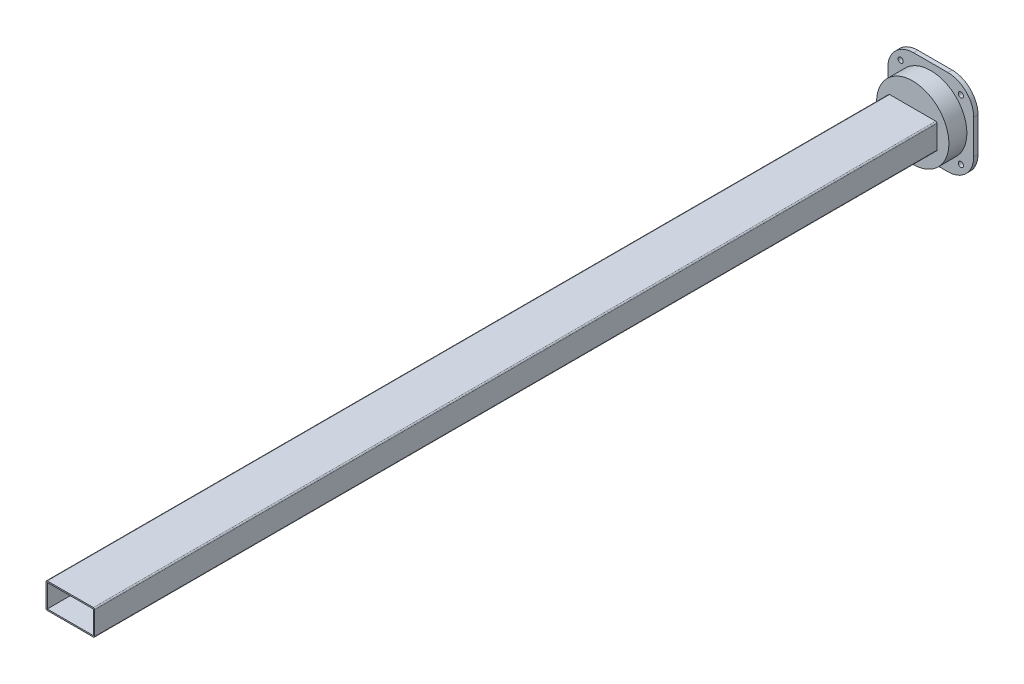
ISO-10303-21;
HEADER;
FILE_DESCRIPTION(('STEP AP214'),'2;1');
FILE_NAME('part.step','',(''),(''),'','','');
FILE_SCHEMA(('AUTOMOTIVE_DESIGN { 1 0 10303 214 1 1 1 1 }'));
ENDSEC;
DATA;
#1=APPLICATION_CONTEXT('core data for automotive mechanical design processes');
#2=APPLICATION_PROTOCOL_DEFINITION('international standard','automotive_design',2000,#1);
#3=PRODUCT_CONTEXT('',#1,'mechanical');
#4=PRODUCT('Part','Part','',(#3));
#5=PRODUCT_RELATED_PRODUCT_CATEGORY('part','',(#4));
#6=PRODUCT_DEFINITION_FORMATION('','',#4);
#7=PRODUCT_DEFINITION_CONTEXT('part definition',#1,'design');
#8=PRODUCT_DEFINITION('design','',#6,#7);
#9=PRODUCT_DEFINITION_SHAPE('','',#8);
#10=(LENGTH_UNIT() NAMED_UNIT(*) SI_UNIT(.MILLI.,.METRE.));
#11=(NAMED_UNIT(*) PLANE_ANGLE_UNIT() SI_UNIT($,.RADIAN.));
#12=(NAMED_UNIT(*) SI_UNIT($,.STERADIAN.) SOLID_ANGLE_UNIT());
#13=UNCERTAINTY_MEASURE_WITH_UNIT(LENGTH_MEASURE(1.E-05),#10,'distance_accuracy_value','');
#14=(GEOMETRIC_REPRESENTATION_CONTEXT(3) GLOBAL_UNCERTAINTY_ASSIGNED_CONTEXT((#13)) GLOBAL_UNIT_ASSIGNED_CONTEXT((#10,
#11,#12)) REPRESENTATION_CONTEXT('',''));
#15=CARTESIAN_POINT('',(0.,0.,0.));
#16=DIRECTION('',(0.,0.,1.));
#17=DIRECTION('',(1.,0.,0.));
#18=AXIS2_PLACEMENT_3D('',#15,#16,#17);
#19=CARTESIAN_POINT('',(19.9299665264319,19.9553177882326,-5.));
#20=DIRECTION('',(0.,0.,1.));
#21=DIRECTION('',(1.,0.,0.));
#22=AXIS2_PLACEMENT_3D('',#19,#20,#21);
#23=PLANE('',#22);
#24=CARTESIAN_POINT('',(0.,0.,-5.));
#25=DIRECTION('',(0.,0.,-1.));
#26=DIRECTION('',(-1.,0.,0.));
#27=AXIS2_PLACEMENT_3D('',#24,#25,#26);
#28=CIRCLE('',#27,35.);
#29=CARTESIAN_POINT('',(-35.,0.,-5.));
#30=VERTEX_POINT('',#29);
#31=EDGE_CURVE('E436',#30,#30,#28,.T.);
#32=ORIENTED_EDGE('',*,*,#31,.T.);
#33=EDGE_LOOP('',(#32));
#34=FACE_BOUND('',#33,.T.);
#35=DIRECTION('',(0.,-1.,0.));
#36=VECTOR('',#35,1.);
#37=CARTESIAN_POINT('',(26.767,19.9553177882326,-5.));
#38=LINE('',#37,#36);
#39=CARTESIAN_POINT('',(26.767,13.3835,-4.99999999999989));
#40=VERTEX_POINT('',#39);
#41=CARTESIAN_POINT('',(26.767,-13.3835,-5.));
#42=VERTEX_POINT('',#41);
#43=EDGE_CURVE('E11',#40,#42,#38,.T.);
#44=ORIENTED_EDGE('',*,*,#43,.F.);
#45=DIRECTION('',(1.,0.,0.));
#46=VECTOR('',#45,1.);
#47=CARTESIAN_POINT('',(19.9299665264319,13.3835,-5.));
#48=LINE('',#47,#46);
#49=CARTESIAN_POINT('',(-26.767,13.3835,-4.99999999999989));
#50=VERTEX_POINT('',#49);
#51=EDGE_CURVE('E48',#50,#40,#48,.T.);
#52=ORIENTED_EDGE('',*,*,#51,.F.);
#53=DIRECTION('',(0.,1.,0.));
#54=VECTOR('',#53,1.);
#55=CARTESIAN_POINT('',(-26.767,19.9553177882326,-5.));
#56=LINE('',#55,#54);
#57=CARTESIAN_POINT('',(-26.767,-13.3835,-4.99999999999989));
#58=VERTEX_POINT('',#57);
#59=EDGE_CURVE('E183',#58,#50,#56,.T.);
#60=ORIENTED_EDGE('',*,*,#59,.F.);
#61=DIRECTION('',(-1.,0.,0.));
#62=VECTOR('',#61,1.);
#63=CARTESIAN_POINT('',(19.9299665264319,-13.3835,-5.));
#64=LINE('',#63,#62);
#65=EDGE_CURVE('E192',#42,#58,#64,.T.);
#66=ORIENTED_EDGE('',*,*,#65,.F.);
#67=EDGE_LOOP('',(#44,#52,#60,#66));
#68=FACE_BOUND('',#67,.T.);
#69=ADVANCED_FACE('F39',(#34,#68),#23,.F.);
#70=CARTESIAN_POINT('',(-26.767,13.3835,1000.));
#71=DIRECTION('',(0.,0.,-1.));
#72=DIRECTION('',(-1.,0.,0.));
#73=AXIS2_PLACEMENT_3D('',#70,#71,#72);
#74=CYLINDRICAL_SURFACE('',#73,1.5);
#75=CARTESIAN_POINT('',(-26.767,13.3835,20.94125));
#76=DIRECTION('',(0.,0.,-1.));
#77=DIRECTION('',(-1.,0.,0.));
#78=AXIS2_PLACEMENT_3D('',#75,#76,#77);
#79=CIRCLE('',#78,1.5);
#80=CARTESIAN_POINT('',(-28.267,13.3835,20.94125));
#81=VERTEX_POINT('',#80);
#82=CARTESIAN_POINT('',(-26.767,14.8835,20.94125));
#83=VERTEX_POINT('',#82);
#84=EDGE_CURVE('E62',#81,#83,#79,.T.);
#85=ORIENTED_EDGE('',*,*,#84,.F.);
#86=DIRECTION('',(0.,0.,-1.));
#87=VECTOR('',#86,1.);
#88=CARTESIAN_POINT('',(-28.267,13.3835,1000.));
#89=LINE('',#88,#87);
#90=CARTESIAN_POINT('',(-28.267,13.3835,1000.));
#91=VERTEX_POINT('',#90);
#92=EDGE_CURVE('E254',#91,#81,#89,.T.);
#93=ORIENTED_EDGE('',*,*,#92,.F.);
#94=CARTESIAN_POINT('',(-26.767,13.3835,1000.));
#95=DIRECTION('',(0.,0.,1.));
#96=DIRECTION('',(1.,0.,0.));
#97=AXIS2_PLACEMENT_3D('',#94,#95,#96);
#98=CIRCLE('',#97,1.5);
#99=CARTESIAN_POINT('',(-26.767,14.8835,1000.));
#100=VERTEX_POINT('',#99);
#101=EDGE_CURVE('E226',#100,#91,#98,.T.);
#102=ORIENTED_EDGE('',*,*,#101,.F.);
#103=DIRECTION('',(0.,0.,-1.));
#104=VECTOR('',#103,1.);
#105=CARTESIAN_POINT('',(-26.767,14.8835,1000.));
#106=LINE('',#105,#104);
#107=EDGE_CURVE('E251',#100,#83,#106,.T.);
#108=ORIENTED_EDGE('',*,*,#107,.T.);
#109=EDGE_LOOP('',(#85,#93,#102,#108));
#110=FACE_BOUND('',#109,.T.);
#111=ADVANCED_FACE('F524',(#110),#74,.T.);
#112=CARTESIAN_POINT('',(-28.267,13.3835,1000.));
#113=DIRECTION('',(1.,0.,0.));
#114=DIRECTION('',(0.,1.,0.));
#115=AXIS2_PLACEMENT_3D('',#112,#113,#114);
#116=PLANE('',#115);
#117=DIRECTION('',(0.,1.,0.));
#118=VECTOR('',#117,1.);
#119=CARTESIAN_POINT('',(-28.267,13.3835,20.94125));
#120=LINE('',#119,#118);
#121=CARTESIAN_POINT('',(-28.267,-13.3835,20.94125));
#122=VERTEX_POINT('',#121);
#123=EDGE_CURVE('E281',#122,#81,#120,.T.);
#124=ORIENTED_EDGE('',*,*,#123,.F.);
#125=DIRECTION('',(0.,0.,-1.));
#126=VECTOR('',#125,1.);
#127=CARTESIAN_POINT('',(-28.267,-13.3835,1000.));
#128=LINE('',#127,#126);
#129=CARTESIAN_POINT('',(-28.267,-13.3835,1000.));
#130=VERTEX_POINT('',#129);
#131=EDGE_CURVE('E273',#130,#122,#128,.T.);
#132=ORIENTED_EDGE('',*,*,#131,.F.);
#133=DIRECTION('',(0.,-1.,0.));
#134=VECTOR('',#133,1.);
#135=CARTESIAN_POINT('',(-28.267,13.3835,1000.));
#136=LINE('',#135,#134);
#137=EDGE_CURVE('E230',#91,#130,#136,.T.);
#138=ORIENTED_EDGE('',*,*,#137,.F.);
#139=ORIENTED_EDGE('',*,*,#92,.T.);
#140=EDGE_LOOP('',(#124,#132,#138,#139));
#141=FACE_BOUND('',#140,.T.);
#142=ADVANCED_FACE('F531',(#141),#116,.F.);
#143=CARTESIAN_POINT('',(-26.767,-13.3835,1000.));
#144=DIRECTION('',(0.,0.,-1.));
#145=DIRECTION('',(-1.,0.,0.));
#146=AXIS2_PLACEMENT_3D('',#143,#144,#145);
#147=CYLINDRICAL_SURFACE('',#146,1.5);
#148=CARTESIAN_POINT('',(-26.767,-13.3835,20.94125));
#149=DIRECTION('',(0.,0.,-1.));
#150=DIRECTION('',(-1.,0.,0.));
#151=AXIS2_PLACEMENT_3D('',#148,#149,#150);
#152=CIRCLE('',#151,1.5);
#153=CARTESIAN_POINT('',(-26.767,-14.8835,20.94125));
#154=VERTEX_POINT('',#153);
#155=EDGE_CURVE('E285',#154,#122,#152,.T.);
#156=ORIENTED_EDGE('',*,*,#155,.F.);
#157=DIRECTION('',(0.,0.,-1.));
#158=VECTOR('',#157,1.);
#159=CARTESIAN_POINT('',(-26.767,-14.8835,1000.));
#160=LINE('',#159,#158);
#161=CARTESIAN_POINT('',(-26.767,-14.8835,1000.));
#162=VERTEX_POINT('',#161);
#163=EDGE_CURVE('E269',#162,#154,#160,.T.);
#164=ORIENTED_EDGE('',*,*,#163,.F.);
#165=CARTESIAN_POINT('',(-26.767,-13.3835,1000.));
#166=DIRECTION('',(0.,0.,1.));
#167=DIRECTION('',(-1.,0.,0.));
#168=AXIS2_PLACEMENT_3D('',#165,#166,#167);
#169=CIRCLE('',#168,1.5);
#170=EDGE_CURVE('E233',#130,#162,#169,.T.);
#171=ORIENTED_EDGE('',*,*,#170,.F.);
#172=ORIENTED_EDGE('',*,*,#131,.T.);
#173=EDGE_LOOP('',(#156,#164,#171,#172));
#174=FACE_BOUND('',#173,.T.);
#175=ADVANCED_FACE('F793',(#174),#147,.T.);
#176=CARTESIAN_POINT('',(-26.767,-14.8835,1000.));
#177=DIRECTION('',(0.,1.,0.));
#178=DIRECTION('',(0.,0.,1.));
#179=AXIS2_PLACEMENT_3D('',#176,#177,#178);
#180=PLANE('',#179);
#181=DIRECTION('',(-1.,0.,0.));
#182=VECTOR('',#181,1.);
#183=CARTESIAN_POINT('',(-26.767,-14.8835,20.94125));
#184=LINE('',#183,#182);
#185=CARTESIAN_POINT('',(26.767,-14.8835,20.94125));
#186=VERTEX_POINT('',#185);
#187=EDGE_CURVE('E289',#186,#154,#184,.T.);
#188=ORIENTED_EDGE('',*,*,#187,.F.);
#189=DIRECTION('',(0.,0.,-1.));
#190=VECTOR('',#189,1.);
#191=CARTESIAN_POINT('',(26.767,-14.8835,1000.));
#192=LINE('',#191,#190);
#193=CARTESIAN_POINT('',(26.767,-14.8835,1000.));
#194=VERTEX_POINT('',#193);
#195=EDGE_CURVE('E265',#194,#186,#192,.T.);
#196=ORIENTED_EDGE('',*,*,#195,.F.);
#197=DIRECTION('',(1.,0.,0.));
#198=VECTOR('',#197,1.);
#199=CARTESIAN_POINT('',(-26.767,-14.8835,1000.));
#200=LINE('',#199,#198);
#201=EDGE_CURVE('E236',#162,#194,#200,.T.);
#202=ORIENTED_EDGE('',*,*,#201,.F.);
#203=ORIENTED_EDGE('',*,*,#163,.T.);
#204=EDGE_LOOP('',(#188,#196,#202,#203));
#205=FACE_BOUND('',#204,.T.);
#206=ADVANCED_FACE('F783',(#205),#180,.F.);
#207=CARTESIAN_POINT('',(26.767,-13.3835,1000.));
#208=DIRECTION('',(0.,0.,-1.));
#209=DIRECTION('',(-1.,0.,0.));
#210=AXIS2_PLACEMENT_3D('',#207,#208,#209);
#211=CYLINDRICAL_SURFACE('',#210,1.50000000000001);
#212=CARTESIAN_POINT('',(26.767,-13.3835,20.94125));
#213=DIRECTION('',(0.,0.,-1.));
#214=DIRECTION('',(-1.,0.,0.));
#215=AXIS2_PLACEMENT_3D('',#212,#213,#214);
#216=CIRCLE('',#215,1.50000000000001);
#217=CARTESIAN_POINT('',(28.267,-13.3835,20.94125));
#218=VERTEX_POINT('',#217);
#219=EDGE_CURVE('E293',#218,#186,#216,.T.);
#220=ORIENTED_EDGE('',*,*,#219,.F.);
#221=DIRECTION('',(0.,0.,-1.));
#222=VECTOR('',#221,1.);
#223=CARTESIAN_POINT('',(28.267,-13.3835,1000.));
#224=LINE('',#223,#222);
#225=CARTESIAN_POINT('',(28.267,-13.3835,1000.));
#226=VERTEX_POINT('',#225);
#227=EDGE_CURVE('E261',#226,#218,#224,.T.);
#228=ORIENTED_EDGE('',*,*,#227,.F.);
#229=CARTESIAN_POINT('',(26.767,-13.3835,1000.));
#230=DIRECTION('',(0.,0.,1.));
#231=DIRECTION('',(-1.,0.,0.));
#232=AXIS2_PLACEMENT_3D('',#229,#230,#231);
#233=CIRCLE('',#232,1.50000000000001);
#234=EDGE_CURVE('E239',#194,#226,#233,.T.);
#235=ORIENTED_EDGE('',*,*,#234,.F.);
#236=ORIENTED_EDGE('',*,*,#195,.T.);
#237=EDGE_LOOP('',(#220,#228,#235,#236));
#238=FACE_BOUND('',#237,.T.);
#239=ADVANCED_FACE('F773',(#238),#211,.T.);
#240=CARTESIAN_POINT('',(28.267,13.3835,1000.));
#241=DIRECTION('',(-1.,0.,0.));
#242=DIRECTION('',(0.,-1.,0.));
#243=AXIS2_PLACEMENT_3D('',#240,#241,#242);
#244=PLANE('',#243);
#245=DIRECTION('',(0.,-1.,0.));
#246=VECTOR('',#245,1.);
#247=CARTESIAN_POINT('',(28.267,13.3835,20.94125));
#248=LINE('',#247,#246);
#249=CARTESIAN_POINT('',(28.267,13.3835,20.94125));
#250=VERTEX_POINT('',#249);
#251=EDGE_CURVE('E297',#250,#218,#248,.T.);
#252=ORIENTED_EDGE('',*,*,#251,.F.);
#253=DIRECTION('',(0.,0.,-1.));
#254=VECTOR('',#253,1.);
#255=CARTESIAN_POINT('',(28.267,13.3835,1000.));
#256=LINE('',#255,#254);
#257=CARTESIAN_POINT('',(28.267,13.3835,1000.));
#258=VERTEX_POINT('',#257);
#259=EDGE_CURVE('E257',#258,#250,#256,.T.);
#260=ORIENTED_EDGE('',*,*,#259,.F.);
#261=DIRECTION('',(0.,1.,0.));
#262=VECTOR('',#261,1.);
#263=CARTESIAN_POINT('',(28.267,13.3835,1000.));
#264=LINE('',#263,#262);
#265=EDGE_CURVE('E242',#226,#258,#264,.T.);
#266=ORIENTED_EDGE('',*,*,#265,.F.);
#267=ORIENTED_EDGE('',*,*,#227,.T.);
#268=EDGE_LOOP('',(#252,#260,#266,#267));
#269=FACE_BOUND('',#268,.T.);
#270=ADVANCED_FACE('F763',(#269),#244,.F.);
#271=CARTESIAN_POINT('',(26.767,13.3835,1000.));
#272=DIRECTION('',(0.,0.,-1.));
#273=DIRECTION('',(-1.,0.,0.));
#274=AXIS2_PLACEMENT_3D('',#271,#272,#273);
#275=CYLINDRICAL_SURFACE('',#274,1.50000000000001);
#276=CARTESIAN_POINT('',(26.767,13.3835,20.94125));
#277=DIRECTION('',(0.,0.,-1.));
#278=DIRECTION('',(-1.,0.,0.));
#279=AXIS2_PLACEMENT_3D('',#276,#277,#278);
#280=CIRCLE('',#279,1.50000000000001);
#281=CARTESIAN_POINT('',(26.767,14.8835,20.94125));
#282=VERTEX_POINT('',#281);
#283=EDGE_CURVE('E301',#282,#250,#280,.T.);
#284=ORIENTED_EDGE('',*,*,#283,.F.);
#285=DIRECTION('',(0.,0.,-1.));
#286=VECTOR('',#285,1.);
#287=CARTESIAN_POINT('',(26.767,14.8835,1000.));
#288=LINE('',#287,#286);
#289=CARTESIAN_POINT('',(26.767,14.8835,1000.));
#290=VERTEX_POINT('',#289);
#291=EDGE_CURVE('E225',#290,#282,#288,.T.);
#292=ORIENTED_EDGE('',*,*,#291,.F.);
#293=CARTESIAN_POINT('',(26.767,13.3835,1000.));
#294=DIRECTION('',(0.,0.,1.));
#295=DIRECTION('',(-1.,0.,0.));
#296=AXIS2_PLACEMENT_3D('',#293,#294,#295);
#297=CIRCLE('',#296,1.50000000000001);
#298=EDGE_CURVE('E245',#258,#290,#297,.T.);
#299=ORIENTED_EDGE('',*,*,#298,.F.);
#300=ORIENTED_EDGE('',*,*,#259,.T.);
#301=EDGE_LOOP('',(#284,#292,#299,#300));
#302=FACE_BOUND('',#301,.T.);
#303=ADVANCED_FACE('F753',(#302),#275,.T.);
#304=CARTESIAN_POINT('',(-26.767,14.8835,1000.));
#305=DIRECTION('',(0.,-1.,0.));
#306=DIRECTION('',(0.,0.,-1.));
#307=AXIS2_PLACEMENT_3D('',#304,#305,#306);
#308=PLANE('',#307);
#309=DIRECTION('',(1.,0.,0.));
#310=VECTOR('',#309,1.);
#311=CARTESIAN_POINT('',(-26.767,14.8835,20.94125));
#312=LINE('',#311,#310);
#313=EDGE_CURVE('E305',#83,#282,#312,.T.);
#314=ORIENTED_EDGE('',*,*,#313,.F.);
#315=ORIENTED_EDGE('',*,*,#107,.F.);
#316=DIRECTION('',(-1.,0.,0.));
#317=VECTOR('',#316,1.);
#318=CARTESIAN_POINT('',(-26.767,14.8835,1000.));
#319=LINE('',#318,#317);
#320=EDGE_CURVE('E248',#290,#100,#319,.T.);
#321=ORIENTED_EDGE('',*,*,#320,.F.);
#322=ORIENTED_EDGE('',*,*,#291,.T.);
#323=EDGE_LOOP('',(#314,#315,#321,#322));
#324=FACE_BOUND('',#323,.T.);
#325=ADVANCED_FACE('F601',(#324),#308,.F.);
#326=CARTESIAN_POINT('',(26.767,13.3835,1000.));
#327=DIRECTION('',(-1.,0.,0.));
#328=DIRECTION('',(0.,0.,1.));
#329=AXIS2_PLACEMENT_3D('',#326,#327,#328);
#330=PLANE('',#329);
#331=DIRECTION('',(0.,0.,-1.));
#332=VECTOR('',#331,1.);
#333=CARTESIAN_POINT('',(26.767,13.3835,1000.));
#334=LINE('',#333,#332);
#335=CARTESIAN_POINT('',(26.767,13.3835,1000.));
#336=VERTEX_POINT('',#335);
#337=EDGE_CURVE('E212',#336,#40,#334,.T.);
#338=ORIENTED_EDGE('',*,*,#337,.T.);
#339=ORIENTED_EDGE('',*,*,#43,.T.);
#340=DIRECTION('',(0.,0.,-1.));
#341=VECTOR('',#340,1.);
#342=CARTESIAN_POINT('',(26.767,-13.3835,1000.));
#343=LINE('',#342,#341);
#344=CARTESIAN_POINT('',(26.767,-13.3835,1000.));
#345=VERTEX_POINT('',#344);
#346=EDGE_CURVE('E55',#345,#42,#343,.T.);
#347=ORIENTED_EDGE('',*,*,#346,.F.);
#348=DIRECTION('',(0.,1.,0.));
#349=VECTOR('',#348,1.);
#350=CARTESIAN_POINT('',(26.767,13.3835,1000.));
#351=LINE('',#350,#349);
#352=EDGE_CURVE('E208',#345,#336,#351,.T.);
#353=ORIENTED_EDGE('',*,*,#352,.T.);
#354=EDGE_LOOP('',(#338,#339,#347,#353));
#355=FACE_BOUND('',#354,.T.);
#356=ADVANCED_FACE('F597',(#355),#330,.T.);
#357=CARTESIAN_POINT('',(-26.767,13.3835,1000.));
#358=DIRECTION('',(0.,-1.,0.));
#359=DIRECTION('',(0.,0.,-1.));
#360=AXIS2_PLACEMENT_3D('',#357,#358,#359);
#361=PLANE('',#360);
#362=DIRECTION('',(0.,0.,-1.));
#363=VECTOR('',#362,1.);
#364=CARTESIAN_POINT('',(-26.767,13.3835,1000.));
#365=LINE('',#364,#363);
#366=CARTESIAN_POINT('',(-26.767,13.3835,1000.));
#367=VERTEX_POINT('',#366);
#368=EDGE_CURVE('E211',#367,#50,#365,.T.);
#369=ORIENTED_EDGE('',*,*,#368,.T.);
#370=ORIENTED_EDGE('',*,*,#51,.T.);
#371=ORIENTED_EDGE('',*,*,#337,.F.);
#372=DIRECTION('',(-1.,0.,0.));
#373=VECTOR('',#372,1.);
#374=CARTESIAN_POINT('',(-26.767,13.3835,1000.));
#375=LINE('',#374,#373);
#376=EDGE_CURVE('E189',#336,#367,#375,.T.);
#377=ORIENTED_EDGE('',*,*,#376,.T.);
#378=EDGE_LOOP('',(#369,#370,#371,#377));
#379=FACE_BOUND('',#378,.T.);
#380=ADVANCED_FACE('F600',(#379),#361,.T.);
#381=CARTESIAN_POINT('',(-26.767,13.3835,1000.));
#382=DIRECTION('',(1.,0.,0.));
#383=DIRECTION('',(0.,0.,-1.));
#384=AXIS2_PLACEMENT_3D('',#381,#382,#383);
#385=PLANE('',#384);
#386=DIRECTION('',(0.,0.,-1.));
#387=VECTOR('',#386,1.);
#388=CARTESIAN_POINT('',(-26.767,-13.3835,1000.));
#389=LINE('',#388,#387);
#390=CARTESIAN_POINT('',(-26.767,-13.3835,1000.));
#391=VERTEX_POINT('',#390);
#392=EDGE_CURVE('E179',#391,#58,#389,.T.);
#393=ORIENTED_EDGE('',*,*,#392,.T.);
#394=ORIENTED_EDGE('',*,*,#59,.T.);
#395=ORIENTED_EDGE('',*,*,#368,.F.);
#396=DIRECTION('',(0.,-1.,0.));
#397=VECTOR('',#396,1.);
#398=CARTESIAN_POINT('',(-26.767,13.3835,1000.));
#399=LINE('',#398,#397);
#400=EDGE_CURVE('E186',#367,#391,#399,.T.);
#401=ORIENTED_EDGE('',*,*,#400,.T.);
#402=EDGE_LOOP('',(#393,#394,#395,#401));
#403=FACE_BOUND('',#402,.T.);
#404=ADVANCED_FACE('F180',(#403),#385,.T.);
#405=CARTESIAN_POINT('',(-26.767,-13.3835,1000.));
#406=DIRECTION('',(0.,1.,0.));
#407=DIRECTION('',(0.,0.,1.));
#408=AXIS2_PLACEMENT_3D('',#405,#406,#407);
#409=PLANE('',#408);
#410=ORIENTED_EDGE('',*,*,#346,.T.);
#411=ORIENTED_EDGE('',*,*,#65,.T.);
#412=ORIENTED_EDGE('',*,*,#392,.F.);
#413=DIRECTION('',(1.,0.,0.));
#414=VECTOR('',#413,1.);
#415=CARTESIAN_POINT('',(-26.767,-13.3835,1000.));
#416=LINE('',#415,#414);
#417=EDGE_CURVE('E207',#391,#345,#416,.T.);
#418=ORIENTED_EDGE('',*,*,#417,.T.);
#419=EDGE_LOOP('',(#410,#411,#412,#418));
#420=FACE_BOUND('',#419,.T.);
#421=ADVANCED_FACE('F193',(#420),#409,.T.);
#422=CARTESIAN_POINT('',(-26.767,13.3835,1000.));
#423=DIRECTION('',(0.,0.,1.));
#424=DIRECTION('',(1.,0.,0.));
#425=AXIS2_PLACEMENT_3D('',#422,#423,#424);
#426=PLANE('',#425);
#427=ORIENTED_EDGE('',*,*,#101,.T.);
#428=ORIENTED_EDGE('',*,*,#137,.T.);
#429=ORIENTED_EDGE('',*,*,#170,.T.);
#430=ORIENTED_EDGE('',*,*,#201,.T.);
#431=ORIENTED_EDGE('',*,*,#234,.T.);
#432=ORIENTED_EDGE('',*,*,#265,.T.);
#433=ORIENTED_EDGE('',*,*,#298,.T.);
#434=ORIENTED_EDGE('',*,*,#320,.T.);
#435=EDGE_LOOP('',(#427,#428,#429,#430,#431,#432,#433,#434));
#436=FACE_BOUND('',#435,.T.);
#437=ORIENTED_EDGE('',*,*,#376,.F.);
#438=ORIENTED_EDGE('',*,*,#352,.F.);
#439=ORIENTED_EDGE('',*,*,#417,.F.);
#440=ORIENTED_EDGE('',*,*,#400,.F.);
#441=EDGE_LOOP('',(#437,#438,#439,#440));
#442=FACE_BOUND('',#441,.T.);
#443=ADVANCED_FACE('F630',(#436,#442),#426,.T.);
#444=CARTESIAN_POINT('',(0.,0.,20.94125));
#445=DIRECTION('',(0.,0.,-1.));
#446=DIRECTION('',(-1.,0.,0.));
#447=AXIS2_PLACEMENT_3D('',#444,#445,#446);
#448=CYLINDRICAL_SURFACE('',#447,42.);
#449=CARTESIAN_POINT('',(0.,0.,0.));
#450=DIRECTION('',(0.,0.,1.));
#451=DIRECTION('',(1.,0.,0.));
#452=AXIS2_PLACEMENT_3D('',#449,#450,#451);
#453=CIRCLE('',#452,42.);
#454=CARTESIAN_POINT('',(42.,0.,0.));
#455=VERTEX_POINT('',#454);
#456=EDGE_CURVE('E197',#455,#455,#453,.F.);
#457=ORIENTED_EDGE('',*,*,#456,.F.);
#458=EDGE_LOOP('',(#457));
#459=FACE_BOUND('',#458,.T.);
#460=CARTESIAN_POINT('',(0.,0.,20.94125));
#461=DIRECTION('',(0.,0.,-1.));
#462=DIRECTION('',(-1.,0.,0.));
#463=AXIS2_PLACEMENT_3D('',#460,#461,#462);
#464=CIRCLE('',#463,42.);
#465=CARTESIAN_POINT('',(-42.,0.,20.94125));
#466=VERTEX_POINT('',#465);
#467=EDGE_CURVE('E309',#466,#466,#464,.T.);
#468=ORIENTED_EDGE('',*,*,#467,.T.);
#469=EDGE_LOOP('',(#468));
#470=FACE_BOUND('',#469,.T.);
#471=ADVANCED_FACE('F636',(#459,#470),#448,.T.);
#472=CARTESIAN_POINT('',(0.,0.,20.94125));
#473=DIRECTION('',(0.,0.,-1.));
#474=DIRECTION('',(-1.,0.,0.));
#475=AXIS2_PLACEMENT_3D('',#472,#473,#474);
#476=PLANE('',#475);
#477=ORIENTED_EDGE('',*,*,#467,.F.);
#478=EDGE_LOOP('',(#477));
#479=FACE_BOUND('',#478,.T.);
#480=ORIENTED_EDGE('',*,*,#123,.T.);
#481=ORIENTED_EDGE('',*,*,#84,.T.);
#482=ORIENTED_EDGE('',*,*,#313,.T.);
#483=ORIENTED_EDGE('',*,*,#283,.T.);
#484=ORIENTED_EDGE('',*,*,#251,.T.);
#485=ORIENTED_EDGE('',*,*,#219,.T.);
#486=ORIENTED_EDGE('',*,*,#187,.T.);
#487=ORIENTED_EDGE('',*,*,#155,.T.);
#488=EDGE_LOOP('',(#480,#481,#482,#483,#484,#485,#486,#487));
#489=FACE_BOUND('',#488,.T.);
#490=ADVANCED_FACE('F640',(#479,#489),#476,.F.);
#491=CARTESIAN_POINT('',(19.9299665264317,49.9553177882326,-5.));
#492=DIRECTION('',(0.,-1.,0.));
#493=DIRECTION('',(0.,0.,-1.));
#494=AXIS2_PLACEMENT_3D('',#491,#492,#493);
#495=PLANE('',#494);
#496=DIRECTION('',(1.,0.,0.));
#497=VECTOR('',#496,1.);
#498=CARTESIAN_POINT('',(19.9299665264317,49.9553177882326,0.));
#499=LINE('',#498,#497);
#500=CARTESIAN_POINT('',(-19.9299665264317,49.9553177882326,0.));
#501=VERTEX_POINT('',#500);
#502=CARTESIAN_POINT('',(19.9299665264317,49.9553177882326,0.));
#503=VERTEX_POINT('',#502);
#504=EDGE_CURVE('E346',#501,#503,#499,.T.);
#505=ORIENTED_EDGE('',*,*,#504,.T.);
#506=DIRECTION('',(0.,0.,1.));
#507=VECTOR('',#506,1.);
#508=CARTESIAN_POINT('',(19.9299665264317,49.9553177882326,-5.));
#509=LINE('',#508,#507);
#510=CARTESIAN_POINT('',(19.9299665264317,49.9553177882326,-5.));
#511=VERTEX_POINT('',#510);
#512=EDGE_CURVE('E341',#511,#503,#509,.T.);
#513=ORIENTED_EDGE('',*,*,#512,.F.);
#514=DIRECTION('',(1.,0.,0.));
#515=VECTOR('',#514,1.);
#516=CARTESIAN_POINT('',(19.9299665264317,49.9553177882326,-5.));
#517=LINE('',#516,#515);
#518=CARTESIAN_POINT('',(-19.9299665264317,49.9553177882326,-5.));
#519=VERTEX_POINT('',#518);
#520=EDGE_CURVE('E345',#519,#511,#517,.T.);
#521=ORIENTED_EDGE('',*,*,#520,.F.);
#522=DIRECTION('',(0.,0.,1.));
#523=VECTOR('',#522,1.);
#524=CARTESIAN_POINT('',(-19.9299665264317,49.9553177882326,-5.));
#525=LINE('',#524,#523);
#526=EDGE_CURVE('E337',#519,#501,#525,.T.);
#527=ORIENTED_EDGE('',*,*,#526,.T.);
#528=EDGE_LOOP('',(#505,#513,#521,#527));
#529=FACE_BOUND('',#528,.T.);
#530=ADVANCED_FACE('F507',(#529),#495,.F.);
#531=CARTESIAN_POINT('',(-19.9299665264319,19.9553177882326,-5.));
#532=DIRECTION('',(0.,0.,1.));
#533=DIRECTION('',(1.,0.,0.));
#534=AXIS2_PLACEMENT_3D('',#531,#532,#533);
#535=CYLINDRICAL_SURFACE('',#534,30.);
#536=CARTESIAN_POINT('',(-19.9299665264319,19.9553177882326,0.));
#537=DIRECTION('',(0.,0.,-1.));
#538=DIRECTION('',(-1.,0.,0.));
#539=AXIS2_PLACEMENT_3D('',#536,#537,#538);
#540=CIRCLE('',#539,30.);
#541=CARTESIAN_POINT('',(-49.9299665264319,19.9553177882324,0.));
#542=VERTEX_POINT('',#541);
#543=EDGE_CURVE('E350',#542,#501,#540,.T.);
#544=ORIENTED_EDGE('',*,*,#543,.T.);
#545=ORIENTED_EDGE('',*,*,#526,.F.);
#546=CARTESIAN_POINT('',(-19.9299665264319,19.9553177882326,-5.));
#547=DIRECTION('',(0.,0.,-1.));
#548=DIRECTION('',(-1.,0.,0.));
#549=AXIS2_PLACEMENT_3D('',#546,#547,#548);
#550=CIRCLE('',#549,30.);
#551=CARTESIAN_POINT('',(-49.9299665264319,19.9553177882324,-5.));
#552=VERTEX_POINT('',#551);
#553=EDGE_CURVE('E375',#552,#519,#550,.T.);
#554=ORIENTED_EDGE('',*,*,#553,.F.);
#555=DIRECTION('',(0.,0.,1.));
#556=VECTOR('',#555,1.);
#557=CARTESIAN_POINT('',(-49.9299665264319,19.9553177882324,-5.));
#558=LINE('',#557,#556);
#559=EDGE_CURVE('E333',#552,#542,#558,.T.);
#560=ORIENTED_EDGE('',*,*,#559,.T.);
#561=EDGE_LOOP('',(#544,#545,#554,#560));
#562=FACE_BOUND('',#561,.T.);
#563=ADVANCED_FACE('F503',(#562),#535,.T.);
#564=CARTESIAN_POINT('',(-49.9299665264319,19.9553177882324,-5.));
#565=DIRECTION('',(1.,0.,0.));
#566=DIRECTION('',(0.,0.,-1.));
#567=AXIS2_PLACEMENT_3D('',#564,#565,#566);
#568=PLANE('',#567);
#569=DIRECTION('',(0.,1.,0.));
#570=VECTOR('',#569,1.);
#571=CARTESIAN_POINT('',(-49.9299665264319,19.9553177882324,0.));
#572=LINE('',#571,#570);
#573=CARTESIAN_POINT('',(-49.9299665264319,-19.9553177882326,0.));
#574=VERTEX_POINT('',#573);
#575=EDGE_CURVE('E353',#574,#542,#572,.T.);
#576=ORIENTED_EDGE('',*,*,#575,.T.);
#577=ORIENTED_EDGE('',*,*,#559,.F.);
#578=DIRECTION('',(0.,1.,0.));
#579=VECTOR('',#578,1.);
#580=CARTESIAN_POINT('',(-49.9299665264319,19.9553177882324,-5.));
#581=LINE('',#580,#579);
#582=CARTESIAN_POINT('',(-49.9299665264319,-19.9553177882326,-5.));
#583=VERTEX_POINT('',#582);
#584=EDGE_CURVE('E378',#583,#552,#581,.T.);
#585=ORIENTED_EDGE('',*,*,#584,.F.);
#586=DIRECTION('',(0.,0.,1.));
#587=VECTOR('',#586,1.);
#588=CARTESIAN_POINT('',(-49.9299665264319,-19.9553177882326,-5.));
#589=LINE('',#588,#587);
#590=EDGE_CURVE('E329',#583,#574,#589,.T.);
#591=ORIENTED_EDGE('',*,*,#590,.T.);
#592=EDGE_LOOP('',(#576,#577,#585,#591));
#593=FACE_BOUND('',#592,.T.);
#594=ADVANCED_FACE('F499',(#593),#568,.F.);
#595=CARTESIAN_POINT('',(-19.9299665264319,-19.9553177882326,-5.));
#596=DIRECTION('',(0.,0.,1.));
#597=DIRECTION('',(1.,0.,0.));
#598=AXIS2_PLACEMENT_3D('',#595,#596,#597);
#599=CYLINDRICAL_SURFACE('',#598,30.);
#600=CARTESIAN_POINT('',(-19.9299665264319,-19.9553177882326,0.));
#601=DIRECTION('',(0.,0.,-1.));
#602=DIRECTION('',(-1.,0.,0.));
#603=AXIS2_PLACEMENT_3D('',#600,#601,#602);
#604=CIRCLE('',#603,30.);
#605=CARTESIAN_POINT('',(-19.9299665264317,-49.9553177882326,0.));
#606=VERTEX_POINT('',#605);
#607=EDGE_CURVE('E356',#606,#574,#604,.T.);
#608=ORIENTED_EDGE('',*,*,#607,.T.);
#609=ORIENTED_EDGE('',*,*,#590,.F.);
#610=CARTESIAN_POINT('',(-19.9299665264319,-19.9553177882326,-5.));
#611=DIRECTION('',(0.,0.,-1.));
#612=DIRECTION('',(-1.,0.,0.));
#613=AXIS2_PLACEMENT_3D('',#610,#611,#612);
#614=CIRCLE('',#613,30.);
#615=CARTESIAN_POINT('',(-19.9299665264317,-49.9553177882326,-5.));
#616=VERTEX_POINT('',#615);
#617=EDGE_CURVE('E381',#616,#583,#614,.T.);
#618=ORIENTED_EDGE('',*,*,#617,.F.);
#619=DIRECTION('',(0.,0.,1.));
#620=VECTOR('',#619,1.);
#621=CARTESIAN_POINT('',(-19.9299665264317,-49.9553177882326,-5.));
#622=LINE('',#621,#620);
#623=EDGE_CURVE('E325',#616,#606,#622,.T.);
#624=ORIENTED_EDGE('',*,*,#623,.T.);
#625=EDGE_LOOP('',(#608,#609,#618,#624));
#626=FACE_BOUND('',#625,.T.);
#627=ADVANCED_FACE('F494',(#626),#599,.T.);
#628=CARTESIAN_POINT('',(19.9299665264317,-49.9553177882326,-5.));
#629=DIRECTION('',(0.,1.,0.));
#630=DIRECTION('',(0.,0.,1.));
#631=AXIS2_PLACEMENT_3D('',#628,#629,#630);
#632=PLANE('',#631);
#633=DIRECTION('',(-1.,0.,0.));
#634=VECTOR('',#633,1.);
#635=CARTESIAN_POINT('',(19.9299665264317,-49.9553177882326,0.));
#636=LINE('',#635,#634);
#637=CARTESIAN_POINT('',(19.9299665264317,-49.9553177882326,0.));
#638=VERTEX_POINT('',#637);
#639=EDGE_CURVE('E359',#638,#606,#636,.T.);
#640=ORIENTED_EDGE('',*,*,#639,.T.);
#641=ORIENTED_EDGE('',*,*,#623,.F.);
#642=DIRECTION('',(-1.,0.,0.));
#643=VECTOR('',#642,1.);
#644=CARTESIAN_POINT('',(19.9299665264317,-49.9553177882326,-5.));
#645=LINE('',#644,#643);
#646=CARTESIAN_POINT('',(19.9299665264317,-49.9553177882326,-5.));
#647=VERTEX_POINT('',#646);
#648=EDGE_CURVE('E384',#647,#616,#645,.T.);
#649=ORIENTED_EDGE('',*,*,#648,.F.);
#650=DIRECTION('',(0.,0.,1.));
#651=VECTOR('',#650,1.);
#652=CARTESIAN_POINT('',(19.9299665264317,-49.9553177882326,-5.));
#653=LINE('',#652,#651);
#654=EDGE_CURVE('E321',#647,#638,#653,.T.);
#655=ORIENTED_EDGE('',*,*,#654,.T.);
#656=EDGE_LOOP('',(#640,#641,#649,#655));
#657=FACE_BOUND('',#656,.T.);
#658=ADVANCED_FACE('F490',(#657),#632,.F.);
#659=CARTESIAN_POINT('',(19.9299665264319,-19.9553177882326,-5.));
#660=DIRECTION('',(0.,0.,1.));
#661=DIRECTION('',(1.,0.,0.));
#662=AXIS2_PLACEMENT_3D('',#659,#660,#661);
#663=CYLINDRICAL_SURFACE('',#662,30.);
#664=CARTESIAN_POINT('',(19.9299665264319,-19.9553177882326,0.));
#665=DIRECTION('',(0.,0.,-1.));
#666=DIRECTION('',(1.,0.,0.));
#667=AXIS2_PLACEMENT_3D('',#664,#665,#666);
#668=CIRCLE('',#667,30.);
#669=CARTESIAN_POINT('',(49.9299665264319,-19.9553177882323,0.));
#670=VERTEX_POINT('',#669);
#671=EDGE_CURVE('E362',#670,#638,#668,.T.);
#672=ORIENTED_EDGE('',*,*,#671,.T.);
#673=ORIENTED_EDGE('',*,*,#654,.F.);
#674=CARTESIAN_POINT('',(19.9299665264319,-19.9553177882326,-5.));
#675=DIRECTION('',(0.,0.,-1.));
#676=DIRECTION('',(1.,0.,0.));
#677=AXIS2_PLACEMENT_3D('',#674,#675,#676);
#678=CIRCLE('',#677,30.);
#679=CARTESIAN_POINT('',(49.9299665264319,-19.9553177882323,-5.));
#680=VERTEX_POINT('',#679);
#681=EDGE_CURVE('E387',#680,#647,#678,.T.);
#682=ORIENTED_EDGE('',*,*,#681,.F.);
#683=DIRECTION('',(0.,0.,1.));
#684=VECTOR('',#683,1.);
#685=CARTESIAN_POINT('',(49.9299665264319,-19.9553177882323,-5.));
#686=LINE('',#685,#684);
#687=EDGE_CURVE('E317',#680,#670,#686,.T.);
#688=ORIENTED_EDGE('',*,*,#687,.T.);
#689=EDGE_LOOP('',(#672,#673,#682,#688));
#690=FACE_BOUND('',#689,.T.);
#691=ADVANCED_FACE('F484',(#690),#663,.T.);
#692=CARTESIAN_POINT('',(49.9299665264319,19.9553177882324,-5.));
#693=DIRECTION('',(-1.,0.,0.));
#694=DIRECTION('',(0.,0.,1.));
#695=AXIS2_PLACEMENT_3D('',#692,#693,#694);
#696=PLANE('',#695);
#697=DIRECTION('',(0.,-1.,0.));
#698=VECTOR('',#697,1.);
#699=CARTESIAN_POINT('',(49.9299665264319,19.9553177882324,0.));
#700=LINE('',#699,#698);
#701=CARTESIAN_POINT('',(49.9299665264319,19.9553177882324,0.));
#702=VERTEX_POINT('',#701);
#703=EDGE_CURVE('E365',#702,#670,#700,.T.);
#704=ORIENTED_EDGE('',*,*,#703,.T.);
#705=ORIENTED_EDGE('',*,*,#687,.F.);
#706=DIRECTION('',(0.,-1.,0.));
#707=VECTOR('',#706,1.);
#708=CARTESIAN_POINT('',(49.9299665264319,19.9553177882324,-5.));
#709=LINE('',#708,#707);
#710=CARTESIAN_POINT('',(49.9299665264319,19.9553177882324,-5.));
#711=VERTEX_POINT('',#710);
#712=EDGE_CURVE('E390',#711,#680,#709,.T.);
#713=ORIENTED_EDGE('',*,*,#712,.F.);
#714=DIRECTION('',(0.,0.,1.));
#715=VECTOR('',#714,1.);
#716=CARTESIAN_POINT('',(49.9299665264319,19.9553177882324,-5.));
#717=LINE('',#716,#715);
#718=EDGE_CURVE('E313',#711,#702,#717,.T.);
#719=ORIENTED_EDGE('',*,*,#718,.T.);
#720=EDGE_LOOP('',(#704,#705,#713,#719));
#721=FACE_BOUND('',#720,.T.);
#722=ADVANCED_FACE('F479',(#721),#696,.F.);
#723=CARTESIAN_POINT('',(19.9299665264319,19.9553177882326,0.));
#724=DIRECTION('',(0.,0.,1.));
#725=DIRECTION('',(1.,0.,0.));
#726=AXIS2_PLACEMENT_3D('',#723,#724,#725);
#727=PLANE('',#726);
#728=ORIENTED_EDGE('',*,*,#456,.T.);
#729=EDGE_LOOP('',(#728));
#730=FACE_BOUND('',#729,.T.);
#731=CARTESIAN_POINT('',(-35.,35.,0.));
#732=DIRECTION('',(0.,0.,1.));
#733=DIRECTION('',(1.,0.,0.));
#734=AXIS2_PLACEMENT_3D('',#731,#732,#733);
#735=CIRCLE('',#734,3.);
#736=CARTESIAN_POINT('',(-32.,35.,0.));
#737=VERTEX_POINT('',#736);
#738=EDGE_CURVE('E372',#737,#737,#735,.T.);
#739=ORIENTED_EDGE('',*,*,#738,.F.);
#740=EDGE_LOOP('',(#739));
#741=FACE_BOUND('',#740,.T.);
#742=CARTESIAN_POINT('',(-35.,-35.,0.));
#743=DIRECTION('',(0.,0.,1.));
#744=DIRECTION('',(1.,0.,0.));
#745=AXIS2_PLACEMENT_3D('',#742,#743,#744);
#746=CIRCLE('',#745,3.);
#747=CARTESIAN_POINT('',(-32.,-35.,0.));
#748=VERTEX_POINT('',#747);
#749=EDGE_CURVE('E399',#748,#748,#746,.T.);
#750=ORIENTED_EDGE('',*,*,#749,.F.);
#751=EDGE_LOOP('',(#750));
#752=FACE_BOUND('',#751,.T.);
#753=CARTESIAN_POINT('',(35.,-35.,0.));
#754=DIRECTION('',(0.,0.,1.));
#755=DIRECTION('',(1.,0.,0.));
#756=AXIS2_PLACEMENT_3D('',#753,#754,#755);
#757=CIRCLE('',#756,3.);
#758=CARTESIAN_POINT('',(38.,-35.,0.));
#759=VERTEX_POINT('',#758);
#760=EDGE_CURVE('E403',#759,#759,#757,.T.);
#761=ORIENTED_EDGE('',*,*,#760,.F.);
#762=EDGE_LOOP('',(#761));
#763=FACE_BOUND('',#762,.T.);
#764=CARTESIAN_POINT('',(35.,35.,0.));
#765=DIRECTION('',(0.,0.,1.));
#766=DIRECTION('',(1.,0.,0.));
#767=AXIS2_PLACEMENT_3D('',#764,#765,#766);
#768=CIRCLE('',#767,3.);
#769=CARTESIAN_POINT('',(38.,35.,0.));
#770=VERTEX_POINT('',#769);
#771=EDGE_CURVE('E407',#770,#770,#768,.T.);
#772=ORIENTED_EDGE('',*,*,#771,.F.);
#773=EDGE_LOOP('',(#772));
#774=FACE_BOUND('',#773,.T.);
#775=CARTESIAN_POINT('',(19.9299665264319,19.9553177882326,0.));
#776=DIRECTION('',(0.,0.,-1.));
#777=DIRECTION('',(1.,0.,0.));
#778=AXIS2_PLACEMENT_3D('',#775,#776,#777);
#779=CIRCLE('',#778,30.);
#780=EDGE_CURVE('E368',#503,#702,#779,.T.);
#781=ORIENTED_EDGE('',*,*,#780,.F.);
#782=ORIENTED_EDGE('',*,*,#504,.F.);
#783=ORIENTED_EDGE('',*,*,#543,.F.);
#784=ORIENTED_EDGE('',*,*,#575,.F.);
#785=ORIENTED_EDGE('',*,*,#607,.F.);
#786=ORIENTED_EDGE('',*,*,#639,.F.);
#787=ORIENTED_EDGE('',*,*,#671,.F.);
#788=ORIENTED_EDGE('',*,*,#703,.F.);
#789=EDGE_LOOP('',(#781,#782,#783,#784,#785,#786,#787,#788));
#790=FACE_BOUND('',#789,.T.);
#791=ADVANCED_FACE('F509',(#730,#741,#752,#763,#774,#790),#727,.T.);
#792=CARTESIAN_POINT('',(19.9299665264319,19.9553177882326,-5.));
#793=DIRECTION('',(0.,0.,1.));
#794=DIRECTION('',(1.,0.,0.));
#795=AXIS2_PLACEMENT_3D('',#792,#793,#794);
#796=CYLINDRICAL_SURFACE('',#795,30.);
#797=ORIENTED_EDGE('',*,*,#780,.T.);
#798=ORIENTED_EDGE('',*,*,#718,.F.);
#799=CARTESIAN_POINT('',(19.9299665264319,19.9553177882326,-5.));
#800=DIRECTION('',(0.,0.,-1.));
#801=DIRECTION('',(1.,0.,0.));
#802=AXIS2_PLACEMENT_3D('',#799,#800,#801);
#803=CIRCLE('',#802,30.);
#804=EDGE_CURVE('E349',#511,#711,#803,.T.);
#805=ORIENTED_EDGE('',*,*,#804,.F.);
#806=ORIENTED_EDGE('',*,*,#512,.T.);
#807=EDGE_LOOP('',(#797,#798,#805,#806));
#808=FACE_BOUND('',#807,.T.);
#809=ADVANCED_FACE('F476',(#808),#796,.T.);
#810=CARTESIAN_POINT('',(35.,35.,1005.));
#811=DIRECTION('',(0.,0.,-1.));
#812=DIRECTION('',(-1.,0.,0.));
#813=AXIS2_PLACEMENT_3D('',#810,#811,#812);
#814=CYLINDRICAL_SURFACE('',#813,3.);
#815=ORIENTED_EDGE('',*,*,#771,.T.);
#816=EDGE_LOOP('',(#815));
#817=FACE_BOUND('',#816,.T.);
#818=CARTESIAN_POINT('',(35.,35.,-5.));
#819=DIRECTION('',(0.,0.,-1.));
#820=DIRECTION('',(-1.,0.,0.));
#821=AXIS2_PLACEMENT_3D('',#818,#819,#820);
#822=CIRCLE('',#821,3.);
#823=CARTESIAN_POINT('',(32.,35.,-5.));
#824=VERTEX_POINT('',#823);
#825=EDGE_CURVE('E411',#824,#824,#822,.T.);
#826=ORIENTED_EDGE('',*,*,#825,.T.);
#827=EDGE_LOOP('',(#826));
#828=FACE_BOUND('',#827,.T.);
#829=ADVANCED_FACE('F517',(#817,#828),#814,.F.);
#830=CARTESIAN_POINT('',(35.,-35.,1005.));
#831=DIRECTION('',(0.,0.,-1.));
#832=DIRECTION('',(-1.,0.,0.));
#833=AXIS2_PLACEMENT_3D('',#830,#831,#832);
#834=CYLINDRICAL_SURFACE('',#833,3.);
#835=ORIENTED_EDGE('',*,*,#760,.T.);
#836=EDGE_LOOP('',(#835));
#837=FACE_BOUND('',#836,.T.);
#838=CARTESIAN_POINT('',(35.,-35.,-5.));
#839=DIRECTION('',(0.,0.,-1.));
#840=DIRECTION('',(-1.,0.,0.));
#841=AXIS2_PLACEMENT_3D('',#838,#839,#840);
#842=CIRCLE('',#841,3.);
#843=CARTESIAN_POINT('',(32.,-35.,-5.));
#844=VERTEX_POINT('',#843);
#845=EDGE_CURVE('E415',#844,#844,#842,.T.);
#846=ORIENTED_EDGE('',*,*,#845,.T.);
#847=EDGE_LOOP('',(#846));
#848=FACE_BOUND('',#847,.T.);
#849=ADVANCED_FACE('F539',(#837,#848),#834,.F.);
#850=CARTESIAN_POINT('',(-35.,-35.,1005.));
#851=DIRECTION('',(0.,0.,-1.));
#852=DIRECTION('',(-1.,0.,0.));
#853=AXIS2_PLACEMENT_3D('',#850,#851,#852);
#854=CYLINDRICAL_SURFACE('',#853,3.);
#855=ORIENTED_EDGE('',*,*,#749,.T.);
#856=EDGE_LOOP('',(#855));
#857=FACE_BOUND('',#856,.T.);
#858=CARTESIAN_POINT('',(-35.,-35.,-5.));
#859=DIRECTION('',(0.,0.,-1.));
#860=DIRECTION('',(-1.,0.,0.));
#861=AXIS2_PLACEMENT_3D('',#858,#859,#860);
#862=CIRCLE('',#861,3.);
#863=CARTESIAN_POINT('',(-38.,-35.,-5.));
#864=VERTEX_POINT('',#863);
#865=EDGE_CURVE('E420',#864,#864,#862,.T.);
#866=ORIENTED_EDGE('',*,*,#865,.T.);
#867=EDGE_LOOP('',(#866));
#868=FACE_BOUND('',#867,.T.);
#869=ADVANCED_FACE('F542',(#857,#868),#854,.F.);
#870=CARTESIAN_POINT('',(-35.,35.,1005.));
#871=DIRECTION('',(0.,0.,-1.));
#872=DIRECTION('',(-1.,0.,0.));
#873=AXIS2_PLACEMENT_3D('',#870,#871,#872);
#874=CYLINDRICAL_SURFACE('',#873,3.);
#875=ORIENTED_EDGE('',*,*,#738,.T.);
#876=EDGE_LOOP('',(#875));
#877=FACE_BOUND('',#876,.T.);
#878=CARTESIAN_POINT('',(-35.,35.,-5.));
#879=DIRECTION('',(0.,0.,-1.));
#880=DIRECTION('',(-1.,0.,0.));
#881=AXIS2_PLACEMENT_3D('',#878,#879,#880);
#882=CIRCLE('',#881,3.);
#883=CARTESIAN_POINT('',(-38.,35.,-5.));
#884=VERTEX_POINT('',#883);
#885=EDGE_CURVE('E416',#884,#884,#882,.T.);
#886=ORIENTED_EDGE('',*,*,#885,.T.);
#887=EDGE_LOOP('',(#886));
#888=FACE_BOUND('',#887,.T.);
#889=ADVANCED_FACE('F461',(#877,#888),#874,.F.);
#890=CARTESIAN_POINT('',(0.,0.,-5.));
#891=DIRECTION('',(0.,0.,-1.));
#892=DIRECTION('',(-1.,0.,0.));
#893=AXIS2_PLACEMENT_3D('',#890,#891,#892);
#894=CIRCLE('',#893,40.);
#895=CARTESIAN_POINT('',(-40.,0.,-5.));
#896=VERTEX_POINT('',#895);
#897=EDGE_CURVE('E428',#896,#896,#894,.T.);
#898=ORIENTED_EDGE('',*,*,#897,.F.);
#899=EDGE_LOOP('',(#898));
#900=FACE_BOUND('',#899,.T.);
#901=ORIENTED_EDGE('',*,*,#885,.F.);
#902=EDGE_LOOP('',(#901));
#903=FACE_BOUND('',#902,.T.);
#904=ORIENTED_EDGE('',*,*,#865,.F.);
#905=EDGE_LOOP('',(#904));
#906=FACE_BOUND('',#905,.T.);
#907=ORIENTED_EDGE('',*,*,#845,.F.);
#908=EDGE_LOOP('',(#907));
#909=FACE_BOUND('',#908,.T.);
#910=ORIENTED_EDGE('',*,*,#825,.F.);
#911=EDGE_LOOP('',(#910));
#912=FACE_BOUND('',#911,.T.);
#913=ORIENTED_EDGE('',*,*,#804,.T.);
#914=ORIENTED_EDGE('',*,*,#712,.T.);
#915=ORIENTED_EDGE('',*,*,#681,.T.);
#916=ORIENTED_EDGE('',*,*,#648,.T.);
#917=ORIENTED_EDGE('',*,*,#617,.T.);
#918=ORIENTED_EDGE('',*,*,#584,.T.);
#919=ORIENTED_EDGE('',*,*,#553,.T.);
#920=ORIENTED_EDGE('',*,*,#520,.T.);
#921=EDGE_LOOP('',(#913,#914,#915,#916,#917,#918,#919,#920));
#922=FACE_BOUND('',#921,.T.);
#923=ADVANCED_FACE('F41',(#900,#903,#906,#909,#912,#922),#23,.F.);
#924=CARTESIAN_POINT('',(0.,0.,18.94125));
#925=DIRECTION('',(0.,0.,-1.));
#926=DIRECTION('',(-1.,0.,0.));
#927=AXIS2_PLACEMENT_3D('',#924,#925,#926);
#928=CYLINDRICAL_SURFACE('',#927,40.);
#929=CARTESIAN_POINT('',(0.,0.,18.94125));
#930=DIRECTION('',(0.,0.,-1.));
#931=DIRECTION('',(-1.,0.,0.));
#932=AXIS2_PLACEMENT_3D('',#929,#930,#931);
#933=CIRCLE('',#932,40.);
#934=CARTESIAN_POINT('',(-40.,0.,18.94125));
#935=VERTEX_POINT('',#934);
#936=EDGE_CURVE('E421',#935,#935,#933,.T.);
#937=ORIENTED_EDGE('',*,*,#936,.F.);
#938=EDGE_LOOP('',(#937));
#939=FACE_BOUND('',#938,.T.);
#940=ORIENTED_EDGE('',*,*,#897,.T.);
#941=EDGE_LOOP('',(#940));
#942=FACE_BOUND('',#941,.T.);
#943=ADVANCED_FACE('F450',(#939,#942),#928,.F.);
#944=CARTESIAN_POINT('',(0.,0.,18.94125));
#945=DIRECTION('',(0.,0.,-1.));
#946=DIRECTION('',(-1.,0.,0.));
#947=AXIS2_PLACEMENT_3D('',#944,#945,#946);
#948=PLANE('',#947);
#949=CARTESIAN_POINT('',(0.,0.,18.94125));
#950=DIRECTION('',(0.,0.,-1.));
#951=DIRECTION('',(-1.,0.,0.));
#952=AXIS2_PLACEMENT_3D('',#949,#950,#951);
#953=CIRCLE('',#952,35.);
#954=CARTESIAN_POINT('',(-35.,0.,18.94125));
#955=VERTEX_POINT('',#954);
#956=EDGE_CURVE('E432',#955,#955,#953,.T.);
#957=ORIENTED_EDGE('',*,*,#956,.F.);
#958=EDGE_LOOP('',(#957));
#959=FACE_BOUND('',#958,.T.);
#960=ORIENTED_EDGE('',*,*,#936,.T.);
#961=EDGE_LOOP('',(#960));
#962=FACE_BOUND('',#961,.T.);
#963=ADVANCED_FACE('F447',(#959,#962),#948,.T.);
#964=CARTESIAN_POINT('',(0.,0.,18.94125));
#965=DIRECTION('',(0.,0.,-1.));
#966=DIRECTION('',(-1.,0.,0.));
#967=AXIS2_PLACEMENT_3D('',#964,#965,#966);
#968=CYLINDRICAL_SURFACE('',#967,35.);
#969=ORIENTED_EDGE('',*,*,#956,.T.);
#970=EDGE_LOOP('',(#969));
#971=FACE_BOUND('',#970,.T.);
#972=ORIENTED_EDGE('',*,*,#31,.F.);
#973=EDGE_LOOP('',(#972));
#974=FACE_BOUND('',#973,.T.);
#975=ADVANCED_FACE('F444',(#971,#974),#968,.T.);
#976=CLOSED_SHELL('',(#69,#111,#142,#175,#206,#239,#270,#303,#325,#356,#380,#404,#421,#443,#471,
#490,#530,#563,#594,#627,#658,#691,#722,#791,#809,#829,#849,#869,#889,#923,#943,#963,#975));
#977=MANIFOLD_SOLID_BREP('B2',#976);
#978=ADVANCED_BREP_SHAPE_REPRESENTATION('',(#18,#977),#14);
#979=SHAPE_DEFINITION_REPRESENTATION(#9,#978);
ENDSEC;
END-ISO-10303-21;
